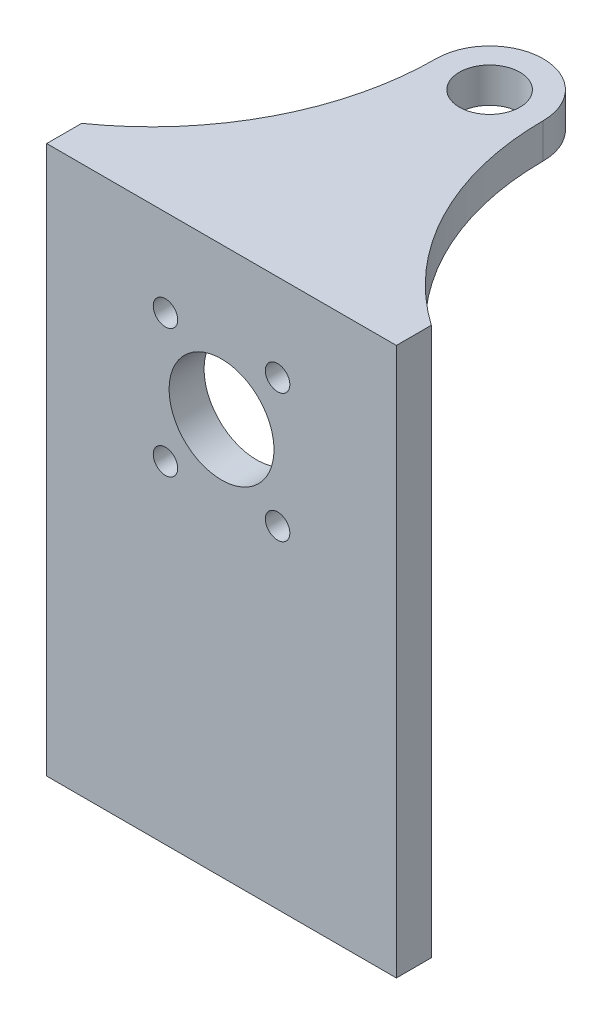
ISO-10303-21;
HEADER;
FILE_DESCRIPTION(('STEP AP214'),'2;1');
FILE_NAME('part.step','',(''),(''),'','','');
FILE_SCHEMA(('AUTOMOTIVE_DESIGN { 1 0 10303 214 1 1 1 1 }'));
ENDSEC;
DATA;
#1=APPLICATION_CONTEXT('core data for automotive mechanical design processes');
#2=APPLICATION_PROTOCOL_DEFINITION('international standard','automotive_design',2000,#1);
#3=PRODUCT_CONTEXT('',#1,'mechanical');
#4=PRODUCT('Part','Part','',(#3));
#5=PRODUCT_RELATED_PRODUCT_CATEGORY('part','',(#4));
#6=PRODUCT_DEFINITION_FORMATION('','',#4);
#7=PRODUCT_DEFINITION_CONTEXT('part definition',#1,'design');
#8=PRODUCT_DEFINITION('design','',#6,#7);
#9=PRODUCT_DEFINITION_SHAPE('','',#8);
#10=(LENGTH_UNIT() NAMED_UNIT(*) SI_UNIT(.MILLI.,.METRE.));
#11=(NAMED_UNIT(*) PLANE_ANGLE_UNIT() SI_UNIT($,.RADIAN.));
#12=(NAMED_UNIT(*) SI_UNIT($,.STERADIAN.) SOLID_ANGLE_UNIT());
#13=UNCERTAINTY_MEASURE_WITH_UNIT(LENGTH_MEASURE(1.E-05),#10,'distance_accuracy_value','');
#14=(GEOMETRIC_REPRESENTATION_CONTEXT(3) GLOBAL_UNCERTAINTY_ASSIGNED_CONTEXT((#13)) GLOBAL_UNIT_ASSIGNED_CONTEXT((#10,
#11,#12)) REPRESENTATION_CONTEXT('',''));
#15=CARTESIAN_POINT('',(0.,0.,0.));
#16=DIRECTION('',(0.,0.,1.));
#17=DIRECTION('',(1.,0.,0.));
#18=AXIS2_PLACEMENT_3D('',#15,#16,#17);
#19=CARTESIAN_POINT('',(0.,-47.,0.));
#20=DIRECTION('',(0.,-1.,0.));
#21=DIRECTION('',(0.,0.,-1.));
#22=AXIS2_PLACEMENT_3D('',#19,#20,#21);
#23=PLANE('',#22);
#24=DIRECTION('',(-1.,0.,0.));
#25=VECTOR('',#24,1.);
#26=CARTESIAN_POINT('',(0.,-47.,11.409451602923));
#27=LINE('',#26,#25);
#28=CARTESIAN_POINT('',(-42.1636561915341,-47.,11.409451602923));
#29=VERTEX_POINT('',#28);
#30=CARTESIAN_POINT('',(-72.1636561915341,-47.,11.409451602923));
#31=VERTEX_POINT('',#30);
#32=EDGE_CURVE('E155',#29,#31,#27,.T.);
#33=ORIENTED_EDGE('',*,*,#32,.T.);
#34=DIRECTION('',(0.,0.,-1.));
#35=VECTOR('',#34,1.);
#36=CARTESIAN_POINT('',(-72.1636561915341,-47.,0.));
#37=LINE('',#36,#35);
#38=CARTESIAN_POINT('',(-72.1636561915341,-47.,8.40945160292299));
#39=VERTEX_POINT('',#38);
#40=EDGE_CURVE('E163',#31,#39,#37,.T.);
#41=ORIENTED_EDGE('',*,*,#40,.T.);
#42=DIRECTION('',(-1.,0.,0.));
#43=VECTOR('',#42,1.);
#44=CARTESIAN_POINT('',(0.,-47.,8.40945160292298));
#45=LINE('',#44,#43);
#46=CARTESIAN_POINT('',(-42.1636561915341,-47.,8.40945160292299));
#47=VERTEX_POINT('',#46);
#48=EDGE_CURVE('E171',#47,#39,#45,.T.);
#49=ORIENTED_EDGE('',*,*,#48,.F.);
#50=DIRECTION('',(0.,0.,-1.));
#51=VECTOR('',#50,1.);
#52=CARTESIAN_POINT('',(-42.1636561915341,-47.,0.));
#53=LINE('',#52,#51);
#54=EDGE_CURVE('E175',#29,#47,#53,.T.);
#55=ORIENTED_EDGE('',*,*,#54,.F.);
#56=EDGE_LOOP('',(#33,#41,#49,#55));
#57=FACE_BOUND('',#56,.T.);
#58=CARTESIAN_POINT('',(-47.1636561915341,-47.,9.90945160292299));
#59=DIRECTION('',(0.,-1.,0.));
#60=DIRECTION('',(0.,0.,-1.));
#61=AXIS2_PLACEMENT_3D('',#58,#59,#60);
#62=CIRCLE('',#61,0.999999999999998);
#63=CARTESIAN_POINT('',(-47.1636561915341,-47.,8.90945160292299));
#64=VERTEX_POINT('',#63);
#65=EDGE_CURVE('E179',#64,#64,#62,.T.);
#66=ORIENTED_EDGE('',*,*,#65,.F.);
#67=EDGE_LOOP('',(#66));
#68=FACE_BOUND('',#67,.T.);
#69=CARTESIAN_POINT('',(-67.1636561915341,-47.,9.90945160292299));
#70=DIRECTION('',(0.,-1.,0.));
#71=DIRECTION('',(0.,0.,-1.));
#72=AXIS2_PLACEMENT_3D('',#69,#70,#71);
#73=CIRCLE('',#72,0.999999999999998);
#74=CARTESIAN_POINT('',(-67.1636561915341,-47.,8.90945160292299));
#75=VERTEX_POINT('',#74);
#76=EDGE_CURVE('E497',#75,#75,#73,.F.);
#77=ORIENTED_EDGE('',*,*,#76,.T.);
#78=EDGE_LOOP('',(#77));
#79=FACE_BOUND('',#78,.T.);
#80=ADVANCED_FACE('F83',(#57,#68,#79),#23,.T.);
#81=CARTESIAN_POINT('',(-86.1944254223033,-3.,-11.590548397077));
#82=DIRECTION('',(0.,1.,0.));
#83=DIRECTION('',(0.,0.,1.));
#84=AXIS2_PLACEMENT_3D('',#81,#82,#83);
#85=CYLINDRICAL_SURFACE('',#84,24.4307692307693);
#86=CARTESIAN_POINT('',(-86.1944254223033,0.,-11.590548397077));
#87=DIRECTION('',(0.,1.,0.));
#88=DIRECTION('',(0.,0.,1.));
#89=AXIS2_PLACEMENT_3D('',#86,#87,#88);
#90=CIRCLE('',#89,24.4307692307693);
#91=CARTESIAN_POINT('',(-61.7636561915341,0.,-11.590548397077));
#92=VERTEX_POINT('',#91);
#93=CARTESIAN_POINT('',(-72.1636561915341,0.,8.40945160292299));
#94=VERTEX_POINT('',#93);
#95=EDGE_CURVE('E160',#92,#94,#90,.F.);
#96=ORIENTED_EDGE('',*,*,#95,.F.);
#97=DIRECTION('',(0.,1.,0.));
#98=VECTOR('',#97,1.);
#99=CARTESIAN_POINT('',(-61.7636561915341,-3.,-11.590548397077));
#100=LINE('',#99,#98);
#101=CARTESIAN_POINT('',(-61.7636561915341,-3.,-11.590548397077));
#102=VERTEX_POINT('',#101);
#103=EDGE_CURVE('E12',#102,#92,#100,.T.);
#104=ORIENTED_EDGE('',*,*,#103,.F.);
#105=CARTESIAN_POINT('',(-86.1944254223033,-3.,-11.590548397077));
#106=DIRECTION('',(0.,1.,0.));
#107=DIRECTION('',(0.,0.,1.));
#108=AXIS2_PLACEMENT_3D('',#105,#106,#107);
#109=CIRCLE('',#108,24.4307692307693);
#110=CARTESIAN_POINT('',(-72.1636561915341,-3.,8.40945160292299));
#111=VERTEX_POINT('',#110);
#112=EDGE_CURVE('E208',#102,#111,#109,.F.);
#113=ORIENTED_EDGE('',*,*,#112,.T.);
#114=DIRECTION('',(0.,1.,0.));
#115=VECTOR('',#114,1.);
#116=CARTESIAN_POINT('',(-72.1636561915341,-3.,8.40945160292299));
#117=LINE('',#116,#115);
#118=EDGE_CURVE('E212',#111,#94,#117,.T.);
#119=ORIENTED_EDGE('',*,*,#118,.T.);
#120=EDGE_LOOP('',(#96,#104,#113,#119));
#121=FACE_BOUND('',#120,.T.);
#122=ADVANCED_FACE('F85',(#121),#85,.F.);
#123=CARTESIAN_POINT('',(-57.1636561915341,-3.,-11.590548397077));
#124=DIRECTION('',(0.,1.,0.));
#125=DIRECTION('',(0.,0.,1.));
#126=AXIS2_PLACEMENT_3D('',#123,#124,#125);
#127=CYLINDRICAL_SURFACE('',#126,4.6);
#128=CARTESIAN_POINT('',(-57.1636561915341,0.,-11.590548397077));
#129=DIRECTION('',(0.,1.,0.));
#130=DIRECTION('',(0.,0.,1.));
#131=AXIS2_PLACEMENT_3D('',#128,#129,#130);
#132=CIRCLE('',#131,4.6);
#133=CARTESIAN_POINT('',(-52.5636561915341,0.,-11.590548397077));
#134=VERTEX_POINT('',#133);
#135=EDGE_CURVE('E223',#134,#92,#132,.T.);
#136=ORIENTED_EDGE('',*,*,#135,.F.);
#137=DIRECTION('',(0.,1.,0.));
#138=VECTOR('',#137,1.);
#139=CARTESIAN_POINT('',(-52.5636561915341,-3.,-11.590548397077));
#140=LINE('',#139,#138);
#141=CARTESIAN_POINT('',(-52.5636561915341,-3.,-11.590548397077));
#142=VERTEX_POINT('',#141);
#143=EDGE_CURVE('E93',#142,#134,#140,.T.);
#144=ORIENTED_EDGE('',*,*,#143,.F.);
#145=CARTESIAN_POINT('',(-57.1636561915341,-3.,-11.590548397077));
#146=DIRECTION('',(0.,1.,0.));
#147=DIRECTION('',(0.,0.,1.));
#148=AXIS2_PLACEMENT_3D('',#145,#146,#147);
#149=CIRCLE('',#148,4.6);
#150=EDGE_CURVE('E202',#142,#102,#149,.T.);
#151=ORIENTED_EDGE('',*,*,#150,.T.);
#152=ORIENTED_EDGE('',*,*,#103,.T.);
#153=EDGE_LOOP('',(#136,#144,#151,#152));
#154=FACE_BOUND('',#153,.T.);
#155=ADVANCED_FACE('F237',(#154),#127,.T.);
#156=CARTESIAN_POINT('',(-28.1328869607648,-3.,-11.590548397077));
#157=DIRECTION('',(0.,1.,0.));
#158=DIRECTION('',(0.,0.,1.));
#159=AXIS2_PLACEMENT_3D('',#156,#157,#158);
#160=CYLINDRICAL_SURFACE('',#159,24.4307692307693);
#161=CARTESIAN_POINT('',(-28.1328869607648,0.,-11.590548397077));
#162=DIRECTION('',(0.,1.,0.));
#163=DIRECTION('',(0.,0.,1.));
#164=AXIS2_PLACEMENT_3D('',#161,#162,#163);
#165=CIRCLE('',#164,24.4307692307693);
#166=CARTESIAN_POINT('',(-42.1636561915341,0.,8.40945160292299));
#167=VERTEX_POINT('',#166);
#168=EDGE_CURVE('E228',#134,#167,#165,.T.);
#169=ORIENTED_EDGE('',*,*,#168,.T.);
#170=DIRECTION('',(0.,1.,0.));
#171=VECTOR('',#170,1.);
#172=CARTESIAN_POINT('',(-42.1636561915341,-3.,8.40945160292299));
#173=LINE('',#172,#171);
#174=CARTESIAN_POINT('',(-42.1636561915341,-3.,8.40945160292299));
#175=VERTEX_POINT('',#174);
#176=EDGE_CURVE('E209',#175,#167,#173,.T.);
#177=ORIENTED_EDGE('',*,*,#176,.F.);
#178=CARTESIAN_POINT('',(-28.1328869607648,-3.,-11.590548397077));
#179=DIRECTION('',(0.,1.,0.));
#180=DIRECTION('',(0.,0.,1.));
#181=AXIS2_PLACEMENT_3D('',#178,#179,#180);
#182=CIRCLE('',#181,24.4307692307693);
#183=EDGE_CURVE('E207',#142,#175,#182,.T.);
#184=ORIENTED_EDGE('',*,*,#183,.F.);
#185=ORIENTED_EDGE('',*,*,#143,.T.);
#186=EDGE_LOOP('',(#169,#177,#184,#185));
#187=FACE_BOUND('',#186,.T.);
#188=ADVANCED_FACE('F253',(#187),#160,.F.);
#189=CARTESIAN_POINT('',(-57.1636561915341,-3.,-11.590548397077));
#190=DIRECTION('',(0.,1.,0.));
#191=DIRECTION('',(0.,0.,1.));
#192=AXIS2_PLACEMENT_3D('',#189,#190,#191);
#193=CYLINDRICAL_SURFACE('',#192,2.6);
#194=CARTESIAN_POINT('',(-57.1636561915341,-3.,-11.590548397077));
#195=DIRECTION('',(0.,1.,0.));
#196=DIRECTION('',(0.,0.,1.));
#197=AXIS2_PLACEMENT_3D('',#194,#195,#196);
#198=CIRCLE('',#197,2.6);
#199=CARTESIAN_POINT('',(-57.1636561915341,-3.,-8.99054839707701));
#200=VERTEX_POINT('',#199);
#201=EDGE_CURVE('E219',#200,#200,#198,.T.);
#202=ORIENTED_EDGE('',*,*,#201,.F.);
#203=EDGE_LOOP('',(#202));
#204=FACE_BOUND('',#203,.T.);
#205=CARTESIAN_POINT('',(-57.1636561915341,0.,-11.590548397077));
#206=DIRECTION('',(0.,1.,0.));
#207=DIRECTION('',(0.,0.,1.));
#208=AXIS2_PLACEMENT_3D('',#205,#206,#207);
#209=CIRCLE('',#208,2.6);
#210=CARTESIAN_POINT('',(-57.1636561915341,0.,-8.99054839707701));
#211=VERTEX_POINT('',#210);
#212=EDGE_CURVE('E221',#211,#211,#209,.T.);
#213=ORIENTED_EDGE('',*,*,#212,.T.);
#214=EDGE_LOOP('',(#213));
#215=FACE_BOUND('',#214,.T.);
#216=ADVANCED_FACE('F274',(#204,#215),#193,.F.);
#217=CARTESIAN_POINT('',(0.,-3.,0.));
#218=DIRECTION('',(0.,1.,0.));
#219=DIRECTION('',(0.,0.,1.));
#220=AXIS2_PLACEMENT_3D('',#217,#218,#219);
#221=PLANE('',#220);
#222=ORIENTED_EDGE('',*,*,#112,.F.);
#223=ORIENTED_EDGE('',*,*,#150,.F.);
#224=ORIENTED_EDGE('',*,*,#183,.T.);
#225=DIRECTION('',(1.,0.,0.));
#226=VECTOR('',#225,1.);
#227=CARTESIAN_POINT('',(0.,-3.,8.40945160292298));
#228=LINE('',#227,#226);
#229=EDGE_CURVE('E125',#111,#175,#228,.T.);
#230=ORIENTED_EDGE('',*,*,#229,.F.);
#231=EDGE_LOOP('',(#222,#223,#224,#230));
#232=FACE_BOUND('',#231,.T.);
#233=ORIENTED_EDGE('',*,*,#201,.T.);
#234=EDGE_LOOP('',(#233));
#235=FACE_BOUND('',#234,.T.);
#236=ADVANCED_FACE('F238',(#232,#235),#221,.F.);
#237=CARTESIAN_POINT('',(0.,0.,0.));
#238=DIRECTION('',(0.,1.,0.));
#239=DIRECTION('',(0.,0.,1.));
#240=AXIS2_PLACEMENT_3D('',#237,#238,#239);
#241=PLANE('',#240);
#242=ORIENTED_EDGE('',*,*,#95,.T.);
#243=DIRECTION('',(0.,0.,-1.));
#244=VECTOR('',#243,1.);
#245=CARTESIAN_POINT('',(-72.1636561915341,0.,0.));
#246=LINE('',#245,#244);
#247=CARTESIAN_POINT('',(-72.1636561915341,0.,11.409451602923));
#248=VERTEX_POINT('',#247);
#249=EDGE_CURVE('E186',#248,#94,#246,.T.);
#250=ORIENTED_EDGE('',*,*,#249,.F.);
#251=DIRECTION('',(-1.,0.,0.));
#252=VECTOR('',#251,1.);
#253=CARTESIAN_POINT('',(0.,0.,11.409451602923));
#254=LINE('',#253,#252);
#255=CARTESIAN_POINT('',(-42.1636561915341,0.,11.409451602923));
#256=VERTEX_POINT('',#255);
#257=EDGE_CURVE('E157',#256,#248,#254,.T.);
#258=ORIENTED_EDGE('',*,*,#257,.F.);
#259=DIRECTION('',(0.,0.,-1.));
#260=VECTOR('',#259,1.);
#261=CARTESIAN_POINT('',(-42.1636561915341,0.,0.));
#262=LINE('',#261,#260);
#263=EDGE_CURVE('E185',#256,#167,#262,.T.);
#264=ORIENTED_EDGE('',*,*,#263,.T.);
#265=ORIENTED_EDGE('',*,*,#168,.F.);
#266=ORIENTED_EDGE('',*,*,#135,.T.);
#267=EDGE_LOOP('',(#242,#250,#258,#264,#265,#266));
#268=FACE_BOUND('',#267,.T.);
#269=ORIENTED_EDGE('',*,*,#212,.F.);
#270=EDGE_LOOP('',(#269));
#271=FACE_BOUND('',#270,.T.);
#272=ADVANCED_FACE('F246',(#268,#271),#241,.T.);
#273=CARTESIAN_POINT('',(0.,30.1496268633627,8.40945160292298));
#274=DIRECTION('',(0.,0.,1.));
#275=DIRECTION('',(1.,0.,0.));
#276=AXIS2_PLACEMENT_3D('',#273,#274,#275);
#277=PLANE('',#276);
#278=CARTESIAN_POINT('',(-61.9736561915341,-18.515,8.40945160292299));
#279=DIRECTION('',(0.,0.,-1.));
#280=DIRECTION('',(-1.,0.,0.));
#281=AXIS2_PLACEMENT_3D('',#278,#279,#280);
#282=CIRCLE('',#281,1.04999999999998);
#283=CARTESIAN_POINT('',(-63.0236561915341,-18.515,8.40945160292299));
#284=VERTEX_POINT('',#283);
#285=EDGE_CURVE('E471',#284,#284,#282,.T.);
#286=ORIENTED_EDGE('',*,*,#285,.F.);
#287=EDGE_LOOP('',(#286));
#288=FACE_BOUND('',#287,.T.);
#289=CARTESIAN_POINT('',(-61.9736561915341,-7.48500000000001,8.40945160292299));
#290=DIRECTION('',(0.,0.,-1.));
#291=DIRECTION('',(-1.,0.,0.));
#292=AXIS2_PLACEMENT_3D('',#289,#290,#291);
#293=CIRCLE('',#292,1.04999999999998);
#294=CARTESIAN_POINT('',(-63.0236561915341,-7.48500000000001,8.40945160292299));
#295=VERTEX_POINT('',#294);
#296=EDGE_CURVE('E473',#295,#295,#293,.T.);
#297=ORIENTED_EDGE('',*,*,#296,.F.);
#298=EDGE_LOOP('',(#297));
#299=FACE_BOUND('',#298,.T.);
#300=CARTESIAN_POINT('',(-52.3536561915341,-18.515,8.40945160292299));
#301=DIRECTION('',(0.,0.,-1.));
#302=DIRECTION('',(-1.,0.,0.));
#303=AXIS2_PLACEMENT_3D('',#300,#301,#302);
#304=CIRCLE('',#303,1.05);
#305=CARTESIAN_POINT('',(-53.4036561915341,-18.515,8.40945160292299));
#306=VERTEX_POINT('',#305);
#307=EDGE_CURVE('E479',#306,#306,#304,.T.);
#308=ORIENTED_EDGE('',*,*,#307,.F.);
#309=EDGE_LOOP('',(#308));
#310=FACE_BOUND('',#309,.T.);
#311=CARTESIAN_POINT('',(-52.3536561915341,-7.48500000000001,8.40945160292299));
#312=DIRECTION('',(0.,0.,-1.));
#313=DIRECTION('',(-1.,0.,0.));
#314=AXIS2_PLACEMENT_3D('',#311,#312,#313);
#315=CIRCLE('',#314,1.05);
#316=CARTESIAN_POINT('',(-53.4036561915341,-7.48500000000001,8.40945160292299));
#317=VERTEX_POINT('',#316);
#318=EDGE_CURVE('E485',#317,#317,#315,.T.);
#319=ORIENTED_EDGE('',*,*,#318,.F.);
#320=EDGE_LOOP('',(#319));
#321=FACE_BOUND('',#320,.T.);
#322=CARTESIAN_POINT('',(-57.1636561915341,-13.,8.40945160292299));
#323=DIRECTION('',(0.,0.,-1.));
#324=DIRECTION('',(-1.,0.,0.));
#325=AXIS2_PLACEMENT_3D('',#322,#323,#324);
#326=CIRCLE('',#325,4.5);
#327=CARTESIAN_POINT('',(-61.6636561915341,-13.,8.40945160292299));
#328=VERTEX_POINT('',#327);
#329=EDGE_CURVE('E491',#328,#328,#326,.T.);
#330=ORIENTED_EDGE('',*,*,#329,.F.);
#331=EDGE_LOOP('',(#330));
#332=FACE_BOUND('',#331,.T.);
#333=DIRECTION('',(0.,-1.,0.));
#334=VECTOR('',#333,1.);
#335=CARTESIAN_POINT('',(-72.1636561915341,30.1496268633627,8.40945160292299));
#336=LINE('',#335,#334);
#337=EDGE_CURVE('E167',#111,#39,#336,.T.);
#338=ORIENTED_EDGE('',*,*,#337,.F.);
#339=ORIENTED_EDGE('',*,*,#229,.T.);
#340=DIRECTION('',(0.,-1.,0.));
#341=VECTOR('',#340,1.);
#342=CARTESIAN_POINT('',(-42.1636561915341,30.1496268633627,8.40945160292299));
#343=LINE('',#342,#341);
#344=EDGE_CURVE('E193',#175,#47,#343,.T.);
#345=ORIENTED_EDGE('',*,*,#344,.T.);
#346=ORIENTED_EDGE('',*,*,#48,.T.);
#347=EDGE_LOOP('',(#338,#339,#345,#346));
#348=FACE_BOUND('',#347,.T.);
#349=ADVANCED_FACE('F241',(#288,#299,#310,#321,#332,#348),#277,.F.);
#350=CARTESIAN_POINT('',(-72.1636561915341,30.1496268633627,0.));
#351=DIRECTION('',(-1.,0.,0.));
#352=DIRECTION('',(0.,0.,1.));
#353=AXIS2_PLACEMENT_3D('',#350,#351,#352);
#354=PLANE('',#353);
#355=DIRECTION('',(0.,-1.,0.));
#356=VECTOR('',#355,1.);
#357=CARTESIAN_POINT('',(-72.1636561915341,30.1496268633627,11.409451602923));
#358=LINE('',#357,#356);
#359=EDGE_CURVE('E150',#248,#31,#358,.T.);
#360=ORIENTED_EDGE('',*,*,#359,.F.);
#361=ORIENTED_EDGE('',*,*,#249,.T.);
#362=ORIENTED_EDGE('',*,*,#118,.F.);
#363=ORIENTED_EDGE('',*,*,#337,.T.);
#364=ORIENTED_EDGE('',*,*,#40,.F.);
#365=EDGE_LOOP('',(#360,#361,#362,#363,#364));
#366=FACE_BOUND('',#365,.T.);
#367=ADVANCED_FACE('F164',(#366),#354,.T.);
#368=CARTESIAN_POINT('',(-42.1636561915341,30.1496268633627,0.));
#369=DIRECTION('',(-1.,0.,0.));
#370=DIRECTION('',(0.,0.,1.));
#371=AXIS2_PLACEMENT_3D('',#368,#369,#370);
#372=PLANE('',#371);
#373=ORIENTED_EDGE('',*,*,#263,.F.);
#374=DIRECTION('',(0.,-1.,0.));
#375=VECTOR('',#374,1.);
#376=CARTESIAN_POINT('',(-42.1636561915341,30.1496268633627,11.409451602923));
#377=LINE('',#376,#375);
#378=EDGE_CURVE('E189',#256,#29,#377,.T.);
#379=ORIENTED_EDGE('',*,*,#378,.T.);
#380=ORIENTED_EDGE('',*,*,#54,.T.);
#381=ORIENTED_EDGE('',*,*,#344,.F.);
#382=ORIENTED_EDGE('',*,*,#176,.T.);
#383=EDGE_LOOP('',(#373,#379,#380,#381,#382));
#384=FACE_BOUND('',#383,.T.);
#385=ADVANCED_FACE('F244',(#384),#372,.F.);
#386=CARTESIAN_POINT('',(0.,30.1496268633627,11.409451602923));
#387=DIRECTION('',(0.,0.,1.));
#388=DIRECTION('',(1.,0.,0.));
#389=AXIS2_PLACEMENT_3D('',#386,#387,#388);
#390=PLANE('',#389);
#391=CARTESIAN_POINT('',(-61.9736561915341,-18.515,11.409451602923));
#392=DIRECTION('',(0.,0.,-1.));
#393=DIRECTION('',(-1.,0.,0.));
#394=AXIS2_PLACEMENT_3D('',#391,#392,#393);
#395=CIRCLE('',#394,1.04999999999998);
#396=CARTESIAN_POINT('',(-63.0236561915341,-18.515,11.409451602923));
#397=VERTEX_POINT('',#396);
#398=EDGE_CURVE('E468',#397,#397,#395,.T.);
#399=ORIENTED_EDGE('',*,*,#398,.T.);
#400=EDGE_LOOP('',(#399));
#401=FACE_BOUND('',#400,.T.);
#402=CARTESIAN_POINT('',(-61.9736561915341,-7.48500000000001,11.409451602923));
#403=DIRECTION('',(0.,0.,-1.));
#404=DIRECTION('',(-1.,0.,0.));
#405=AXIS2_PLACEMENT_3D('',#402,#403,#404);
#406=CIRCLE('',#405,1.04999999999998);
#407=CARTESIAN_POINT('',(-63.0236561915341,-7.48500000000001,11.409451602923));
#408=VERTEX_POINT('',#407);
#409=EDGE_CURVE('E476',#408,#408,#406,.T.);
#410=ORIENTED_EDGE('',*,*,#409,.T.);
#411=EDGE_LOOP('',(#410));
#412=FACE_BOUND('',#411,.T.);
#413=CARTESIAN_POINT('',(-52.3536561915341,-18.515,11.409451602923));
#414=DIRECTION('',(0.,0.,-1.));
#415=DIRECTION('',(-1.,0.,0.));
#416=AXIS2_PLACEMENT_3D('',#413,#414,#415);
#417=CIRCLE('',#416,1.05);
#418=CARTESIAN_POINT('',(-53.4036561915341,-18.515,11.409451602923));
#419=VERTEX_POINT('',#418);
#420=EDGE_CURVE('E482',#419,#419,#417,.T.);
#421=ORIENTED_EDGE('',*,*,#420,.T.);
#422=EDGE_LOOP('',(#421));
#423=FACE_BOUND('',#422,.T.);
#424=CARTESIAN_POINT('',(-52.3536561915341,-7.48500000000001,11.409451602923));
#425=DIRECTION('',(0.,0.,-1.));
#426=DIRECTION('',(-1.,0.,0.));
#427=AXIS2_PLACEMENT_3D('',#424,#425,#426);
#428=CIRCLE('',#427,1.05);
#429=CARTESIAN_POINT('',(-53.4036561915341,-7.48500000000001,11.409451602923));
#430=VERTEX_POINT('',#429);
#431=EDGE_CURVE('E488',#430,#430,#428,.T.);
#432=ORIENTED_EDGE('',*,*,#431,.T.);
#433=EDGE_LOOP('',(#432));
#434=FACE_BOUND('',#433,.T.);
#435=CARTESIAN_POINT('',(-57.1636561915341,-13.,11.409451602923));
#436=DIRECTION('',(0.,0.,-1.));
#437=DIRECTION('',(-1.,0.,0.));
#438=AXIS2_PLACEMENT_3D('',#435,#436,#437);
#439=CIRCLE('',#438,4.5);
#440=CARTESIAN_POINT('',(-61.6636561915341,-13.,11.409451602923));
#441=VERTEX_POINT('',#440);
#442=EDGE_CURVE('E494',#441,#441,#439,.T.);
#443=ORIENTED_EDGE('',*,*,#442,.T.);
#444=EDGE_LOOP('',(#443));
#445=FACE_BOUND('',#444,.T.);
#446=ORIENTED_EDGE('',*,*,#378,.F.);
#447=ORIENTED_EDGE('',*,*,#257,.T.);
#448=ORIENTED_EDGE('',*,*,#359,.T.);
#449=ORIENTED_EDGE('',*,*,#32,.F.);
#450=EDGE_LOOP('',(#446,#447,#448,#449));
#451=FACE_BOUND('',#450,.T.);
#452=ADVANCED_FACE('F153',(#401,#412,#423,#434,#445,#451),#390,.T.);
#453=CARTESIAN_POINT('',(-47.1636561915341,-37.,9.90945160292299));
#454=DIRECTION('',(0.,-1.,0.));
#455=DIRECTION('',(0.,0.,-1.));
#456=AXIS2_PLACEMENT_3D('',#453,#454,#455);
#457=CYLINDRICAL_SURFACE('',#456,0.999999999999998);
#458=CARTESIAN_POINT('',(-47.1636561915341,-37.,9.90945160292299));
#459=DIRECTION('',(0.,-1.,0.));
#460=DIRECTION('',(0.,0.,-1.));
#461=AXIS2_PLACEMENT_3D('',#458,#459,#460);
#462=CIRCLE('',#461,0.999999999999998);
#463=CARTESIAN_POINT('',(-47.1636561915341,-37.,8.90945160292299));
#464=VERTEX_POINT('',#463);
#465=EDGE_CURVE('E176',#464,#464,#462,.T.);
#466=ORIENTED_EDGE('',*,*,#465,.F.);
#467=EDGE_LOOP('',(#466));
#468=FACE_BOUND('',#467,.T.);
#469=ORIENTED_EDGE('',*,*,#65,.T.);
#470=EDGE_LOOP('',(#469));
#471=FACE_BOUND('',#470,.T.);
#472=ADVANCED_FACE('F260',(#468,#471),#457,.F.);
#473=CARTESIAN_POINT('',(0.,-37.,0.));
#474=DIRECTION('',(0.,-1.,0.));
#475=DIRECTION('',(0.,0.,-1.));
#476=AXIS2_PLACEMENT_3D('',#473,#474,#475);
#477=PLANE('',#476);
#478=ORIENTED_EDGE('',*,*,#465,.T.);
#479=EDGE_LOOP('',(#478));
#480=FACE_BOUND('',#479,.T.);
#481=ADVANCED_FACE('F320',(#480),#477,.T.);
#482=CARTESIAN_POINT('',(-67.1636561915341,-37.,9.90945160292299));
#483=DIRECTION('',(0.,-1.,0.));
#484=DIRECTION('',(0.,0.,-1.));
#485=AXIS2_PLACEMENT_3D('',#482,#483,#484);
#486=CYLINDRICAL_SURFACE('',#485,0.999999999999998);
#487=CARTESIAN_POINT('',(-67.1636561915341,-37.,9.90945160292299));
#488=DIRECTION('',(0.,-1.,0.));
#489=DIRECTION('',(0.,0.,-1.));
#490=AXIS2_PLACEMENT_3D('',#487,#488,#489);
#491=CIRCLE('',#490,0.999999999999998);
#492=CARTESIAN_POINT('',(-67.1636561915341,-37.,8.90945160292299));
#493=VERTEX_POINT('',#492);
#494=EDGE_CURVE('E500',#493,#493,#491,.F.);
#495=ORIENTED_EDGE('',*,*,#494,.T.);
#496=EDGE_LOOP('',(#495));
#497=FACE_BOUND('',#496,.T.);
#498=ORIENTED_EDGE('',*,*,#76,.F.);
#499=EDGE_LOOP('',(#498));
#500=FACE_BOUND('',#499,.T.);
#501=ADVANCED_FACE('F327',(#497,#500),#486,.F.);
#502=CARTESIAN_POINT('',(0.,-37.,0.));
#503=DIRECTION('',(0.,-1.,0.));
#504=DIRECTION('',(0.,0.,-1.));
#505=AXIS2_PLACEMENT_3D('',#502,#503,#504);
#506=PLANE('',#505);
#507=ORIENTED_EDGE('',*,*,#494,.F.);
#508=EDGE_LOOP('',(#507));
#509=FACE_BOUND('',#508,.T.);
#510=ADVANCED_FACE('F334',(#509),#506,.T.);
#511=CARTESIAN_POINT('',(-57.1636561915341,-13.,11.409451602923));
#512=DIRECTION('',(0.,0.,-1.));
#513=DIRECTION('',(-1.,0.,0.));
#514=AXIS2_PLACEMENT_3D('',#511,#512,#513);
#515=CYLINDRICAL_SURFACE('',#514,4.5);
#516=ORIENTED_EDGE('',*,*,#442,.F.);
#517=EDGE_LOOP('',(#516));
#518=FACE_BOUND('',#517,.T.);
#519=ORIENTED_EDGE('',*,*,#329,.T.);
#520=EDGE_LOOP('',(#519));
#521=FACE_BOUND('',#520,.T.);
#522=ADVANCED_FACE('F341',(#518,#521),#515,.F.);
#523=CARTESIAN_POINT('',(-52.3536561915341,-7.48500000000001,11.409451602923));
#524=DIRECTION('',(0.,0.,-1.));
#525=DIRECTION('',(-1.,0.,0.));
#526=AXIS2_PLACEMENT_3D('',#523,#524,#525);
#527=CYLINDRICAL_SURFACE('',#526,1.05);
#528=ORIENTED_EDGE('',*,*,#431,.F.);
#529=EDGE_LOOP('',(#528));
#530=FACE_BOUND('',#529,.T.);
#531=ORIENTED_EDGE('',*,*,#318,.T.);
#532=EDGE_LOOP('',(#531));
#533=FACE_BOUND('',#532,.T.);
#534=ADVANCED_FACE('F348',(#530,#533),#527,.F.);
#535=CARTESIAN_POINT('',(-52.3536561915341,-18.515,11.409451602923));
#536=DIRECTION('',(0.,0.,-1.));
#537=DIRECTION('',(-1.,0.,0.));
#538=AXIS2_PLACEMENT_3D('',#535,#536,#537);
#539=CYLINDRICAL_SURFACE('',#538,1.05);
#540=ORIENTED_EDGE('',*,*,#420,.F.);
#541=EDGE_LOOP('',(#540));
#542=FACE_BOUND('',#541,.T.);
#543=ORIENTED_EDGE('',*,*,#307,.T.);
#544=EDGE_LOOP('',(#543));
#545=FACE_BOUND('',#544,.T.);
#546=ADVANCED_FACE('F356',(#542,#545),#539,.F.);
#547=CARTESIAN_POINT('',(-61.9736561915341,-7.48500000000001,11.409451602923));
#548=DIRECTION('',(0.,0.,-1.));
#549=DIRECTION('',(-1.,0.,0.));
#550=AXIS2_PLACEMENT_3D('',#547,#548,#549);
#551=CYLINDRICAL_SURFACE('',#550,1.04999999999998);
#552=ORIENTED_EDGE('',*,*,#409,.F.);
#553=EDGE_LOOP('',(#552));
#554=FACE_BOUND('',#553,.T.);
#555=ORIENTED_EDGE('',*,*,#296,.T.);
#556=EDGE_LOOP('',(#555));
#557=FACE_BOUND('',#556,.T.);
#558=ADVANCED_FACE('F364',(#554,#557),#551,.F.);
#559=CARTESIAN_POINT('',(-61.9736561915341,-18.515,11.409451602923));
#560=DIRECTION('',(0.,0.,-1.));
#561=DIRECTION('',(-1.,0.,0.));
#562=AXIS2_PLACEMENT_3D('',#559,#560,#561);
#563=CYLINDRICAL_SURFACE('',#562,1.04999999999998);
#564=ORIENTED_EDGE('',*,*,#398,.F.);
#565=EDGE_LOOP('',(#564));
#566=FACE_BOUND('',#565,.T.);
#567=ORIENTED_EDGE('',*,*,#285,.T.);
#568=EDGE_LOOP('',(#567));
#569=FACE_BOUND('',#568,.T.);
#570=ADVANCED_FACE('F372',(#566,#569),#563,.F.);
#571=CLOSED_SHELL('',(#80,#122,#155,#188,#216,#236,#272,#349,#367,#385,#452,#472,#481,#501,#510,
#522,#534,#546,#558,#570));
#572=MANIFOLD_SOLID_BREP('B2',#571);
#573=ADVANCED_BREP_SHAPE_REPRESENTATION('',(#18,#572),#14);
#574=SHAPE_DEFINITION_REPRESENTATION(#9,#573);
ENDSEC;
END-ISO-10303-21;
